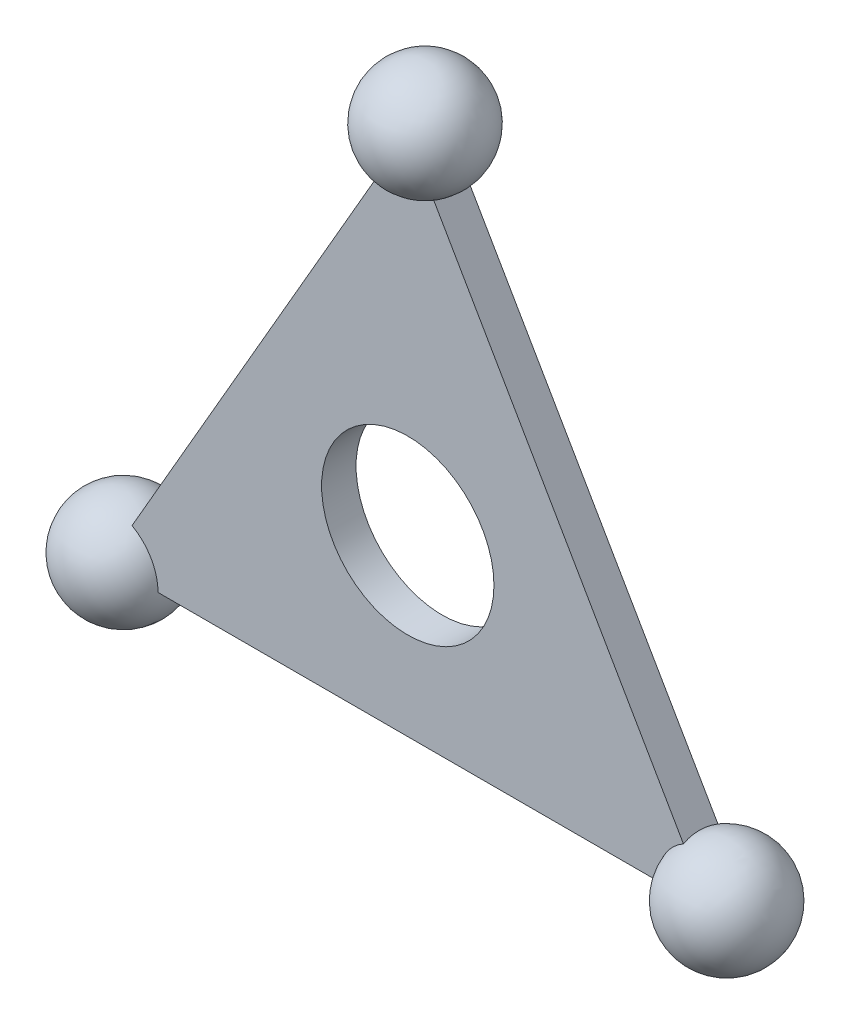
ISO-10303-21;
HEADER;
FILE_DESCRIPTION(('STEP AP214'),'2;1');
FILE_NAME('part.step','',(''),(''),'','','');
FILE_SCHEMA(('AUTOMOTIVE_DESIGN { 1 0 10303 214 1 1 1 1 }'));
ENDSEC;
DATA;
#1=APPLICATION_CONTEXT('core data for automotive mechanical design processes');
#2=APPLICATION_PROTOCOL_DEFINITION('international standard','automotive_design',2000,#1);
#3=PRODUCT_CONTEXT('',#1,'mechanical');
#4=PRODUCT('Part','Part','',(#3));
#5=PRODUCT_RELATED_PRODUCT_CATEGORY('part','',(#4));
#6=PRODUCT_DEFINITION_FORMATION('','',#4);
#7=PRODUCT_DEFINITION_CONTEXT('part definition',#1,'design');
#8=PRODUCT_DEFINITION('design','',#6,#7);
#9=PRODUCT_DEFINITION_SHAPE('','',#8);
#10=(LENGTH_UNIT() NAMED_UNIT(*) SI_UNIT(.MILLI.,.METRE.));
#11=(NAMED_UNIT(*) PLANE_ANGLE_UNIT() SI_UNIT($,.RADIAN.));
#12=(NAMED_UNIT(*) SI_UNIT($,.STERADIAN.) SOLID_ANGLE_UNIT());
#13=UNCERTAINTY_MEASURE_WITH_UNIT(LENGTH_MEASURE(1.E-05),#10,'distance_accuracy_value','');
#14=(GEOMETRIC_REPRESENTATION_CONTEXT(3) GLOBAL_UNCERTAINTY_ASSIGNED_CONTEXT((#13)) GLOBAL_UNIT_ASSIGNED_CONTEXT((#10,
#11,#12)) REPRESENTATION_CONTEXT('',''));
#15=CARTESIAN_POINT('',(0.,0.,0.));
#16=DIRECTION('',(0.,0.,1.));
#17=DIRECTION('',(1.,0.,0.));
#18=AXIS2_PLACEMENT_3D('',#15,#16,#17);
#19=CARTESIAN_POINT('',(0.,0.,2.));
#20=DIRECTION('',(0.,0.,1.));
#21=DIRECTION('',(1.,0.,0.));
#22=AXIS2_PLACEMENT_3D('',#19,#20,#21);
#23=PLANE('',#22);
#24=CARTESIAN_POINT('',(-35.,-20.2072594216365,2.));
#25=DIRECTION('',(0.,0.,1.));
#26=DIRECTION('',(1.,0.,0.));
#27=AXIS2_PLACEMENT_3D('',#24,#25,#26);
#28=CIRCLE('',#27,6.02681507929354);
#29=CARTESIAN_POINT('',(-28.9731849207064,-20.2072594216371,2.));
#30=VERTEX_POINT('',#29);
#31=CARTESIAN_POINT('',(-31.9865924603529,-14.9878844590573,2.));
#32=VERTEX_POINT('',#31);
#33=EDGE_CURVE('E87',#30,#32,#28,.T.);
#34=ORIENTED_EDGE('',*,*,#33,.F.);
#35=DIRECTION('',(1.,0.,0.));
#36=VECTOR('',#35,1.);
#37=CARTESIAN_POINT('',(-35.,-20.2072594216371,2.));
#38=LINE('',#37,#36);
#39=CARTESIAN_POINT('',(28.9731849207062,-20.2072594216371,2.));
#40=VERTEX_POINT('',#39);
#41=EDGE_CURVE('E57',#30,#40,#38,.T.);
#42=ORIENTED_EDGE('',*,*,#41,.T.);
#43=CARTESIAN_POINT('',(34.9999999999997,-20.2072594216369,2.));
#44=DIRECTION('',(0.,0.,1.));
#45=DIRECTION('',(1.,0.,0.));
#46=AXIS2_PLACEMENT_3D('',#43,#44,#45);
#47=CIRCLE('',#46,6.02681507929354);
#48=CARTESIAN_POINT('',(31.9865924603531,-14.9878844590575,2.));
#49=VERTEX_POINT('',#48);
#50=EDGE_CURVE('E135',#49,#40,#47,.T.);
#51=ORIENTED_EDGE('',*,*,#50,.F.);
#52=DIRECTION('',(-0.5,0.866025403784439,0.));
#53=VECTOR('',#52,1.);
#54=CARTESIAN_POINT('',(35.,-20.2072594216371,2.));
#55=LINE('',#54,#53);
#56=CARTESIAN_POINT('',(3.01340753964676,35.1951438806942,2.));
#57=VERTEX_POINT('',#56);
#58=EDGE_CURVE('E105',#49,#57,#55,.T.);
#59=ORIENTED_EDGE('',*,*,#58,.T.);
#60=CARTESIAN_POINT('',(0.,40.4145188432736,2.));
#61=DIRECTION('',(0.,0.,1.));
#62=DIRECTION('',(1.,0.,0.));
#63=AXIS2_PLACEMENT_3D('',#60,#61,#62);
#64=CIRCLE('',#63,6.02681507929354);
#65=CARTESIAN_POINT('',(-3.01340753964678,35.1951438806942,2.));
#66=VERTEX_POINT('',#65);
#67=EDGE_CURVE('E127',#66,#57,#64,.T.);
#68=ORIENTED_EDGE('',*,*,#67,.F.);
#69=DIRECTION('',(-0.5,-0.866025403784439,0.));
#70=VECTOR('',#69,1.);
#71=CARTESIAN_POINT('',(0.,40.4145188432736,2.));
#72=LINE('',#71,#70);
#73=EDGE_CURVE('E95',#66,#32,#72,.T.);
#74=ORIENTED_EDGE('',*,*,#73,.T.);
#75=EDGE_LOOP('',(#34,#42,#51,#59,#68,#74));
#76=FACE_BOUND('',#75,.T.);
#77=CARTESIAN_POINT('',(0.,0.,2.));
#78=DIRECTION('',(0.,0.,1.));
#79=DIRECTION('',(1.,0.,0.));
#80=AXIS2_PLACEMENT_3D('',#77,#78,#79);
#81=CIRCLE('',#80,10.);
#82=CARTESIAN_POINT('',(10.,0.,2.));
#83=VERTEX_POINT('',#82);
#84=EDGE_CURVE('E112',#83,#83,#81,.T.);
#85=ORIENTED_EDGE('',*,*,#84,.F.);
#86=EDGE_LOOP('',(#85));
#87=FACE_BOUND('',#86,.T.);
#88=ADVANCED_FACE('F35',(#76,#87),#23,.T.);
#89=CARTESIAN_POINT('',(0.,0.,-2.));
#90=DIRECTION('',(0.,0.,1.));
#91=DIRECTION('',(1.,0.,0.));
#92=AXIS2_PLACEMENT_3D('',#89,#90,#91);
#93=PLANE('',#92);
#94=DIRECTION('',(1.,0.,0.));
#95=VECTOR('',#94,1.);
#96=CARTESIAN_POINT('',(-35.,-20.2072594216371,-2.));
#97=LINE('',#96,#95);
#98=CARTESIAN_POINT('',(-28.9731849207064,-20.2072594216371,-2.));
#99=VERTEX_POINT('',#98);
#100=CARTESIAN_POINT('',(28.9731849207062,-20.2072594216371,-2.));
#101=VERTEX_POINT('',#100);
#102=EDGE_CURVE('E115',#99,#101,#97,.T.);
#103=ORIENTED_EDGE('',*,*,#102,.F.);
#104=CARTESIAN_POINT('',(-35.,-20.2072594216365,-2.));
#105=DIRECTION('',(0.,0.,1.));
#106=DIRECTION('',(1.,0.,0.));
#107=AXIS2_PLACEMENT_3D('',#104,#105,#106);
#108=CIRCLE('',#107,6.02681507929354);
#109=CARTESIAN_POINT('',(-31.9865924603529,-14.9878844590573,-2.));
#110=VERTEX_POINT('',#109);
#111=EDGE_CURVE('E50',#99,#110,#108,.T.);
#112=ORIENTED_EDGE('',*,*,#111,.T.);
#113=DIRECTION('',(-0.5,-0.866025403784439,0.));
#114=VECTOR('',#113,1.);
#115=CARTESIAN_POINT('',(0.,40.4145188432736,-2.));
#116=LINE('',#115,#114);
#117=CARTESIAN_POINT('',(-3.01340753964678,35.1951438806942,-2.));
#118=VERTEX_POINT('',#117);
#119=EDGE_CURVE('E111',#118,#110,#116,.T.);
#120=ORIENTED_EDGE('',*,*,#119,.F.);
#121=CARTESIAN_POINT('',(0.,40.4145188432736,-2.));
#122=DIRECTION('',(0.,0.,1.));
#123=DIRECTION('',(1.,0.,0.));
#124=AXIS2_PLACEMENT_3D('',#121,#122,#123);
#125=CIRCLE('',#124,6.02681507929354);
#126=CARTESIAN_POINT('',(3.01340753964676,35.1951438806942,-2.));
#127=VERTEX_POINT('',#126);
#128=EDGE_CURVE('E129',#118,#127,#125,.T.);
#129=ORIENTED_EDGE('',*,*,#128,.T.);
#130=DIRECTION('',(-0.5,0.866025403784439,0.));
#131=VECTOR('',#130,1.);
#132=CARTESIAN_POINT('',(35.,-20.2072594216371,-2.));
#133=LINE('',#132,#131);
#134=CARTESIAN_POINT('',(31.9865924603531,-14.9878844590575,-2.));
#135=VERTEX_POINT('',#134);
#136=EDGE_CURVE('E109',#135,#127,#133,.T.);
#137=ORIENTED_EDGE('',*,*,#136,.F.);
#138=CARTESIAN_POINT('',(34.9999999999997,-20.2072594216369,-2.));
#139=DIRECTION('',(0.,0.,1.));
#140=DIRECTION('',(1.,0.,0.));
#141=AXIS2_PLACEMENT_3D('',#138,#139,#140);
#142=CIRCLE('',#141,6.02681507929354);
#143=EDGE_CURVE('E137',#135,#101,#142,.T.);
#144=ORIENTED_EDGE('',*,*,#143,.T.);
#145=EDGE_LOOP('',(#103,#112,#120,#129,#137,#144));
#146=FACE_BOUND('',#145,.T.);
#147=CARTESIAN_POINT('',(0.,0.,-2.));
#148=DIRECTION('',(0.,0.,1.));
#149=DIRECTION('',(1.,0.,0.));
#150=AXIS2_PLACEMENT_3D('',#147,#148,#149);
#151=CIRCLE('',#150,10.);
#152=CARTESIAN_POINT('',(10.,0.,-2.));
#153=VERTEX_POINT('',#152);
#154=EDGE_CURVE('E119',#153,#153,#151,.T.);
#155=ORIENTED_EDGE('',*,*,#154,.T.);
#156=EDGE_LOOP('',(#155));
#157=FACE_BOUND('',#156,.T.);
#158=ADVANCED_FACE('F143',(#146,#157),#93,.F.);
#159=CARTESIAN_POINT('',(35.,-20.2072594216371,2.));
#160=DIRECTION('',(-0.866025403784439,-0.5,0.));
#161=DIRECTION('',(0.5,-0.866025403784439,0.));
#162=AXIS2_PLACEMENT_3D('',#159,#160,#161);
#163=PLANE('',#162);
#164=ORIENTED_EDGE('',*,*,#58,.F.);
#165=CARTESIAN_POINT('',(34.9999999999999,-20.2072594216369,0.));
#166=DIRECTION('',(-0.866025403784439,-0.5,0.));
#167=DIRECTION('',(0.5,-0.866025403784439,0.));
#168=AXIS2_PLACEMENT_3D('',#165,#166,#167);
#169=CIRCLE('',#168,6.35);
#170=EDGE_CURVE('E132',#49,#135,#169,.T.);
#171=ORIENTED_EDGE('',*,*,#170,.T.);
#172=ORIENTED_EDGE('',*,*,#136,.T.);
#173=CARTESIAN_POINT('',(0.,40.4145188432736,0.));
#174=DIRECTION('',(-0.866025403784439,-0.5,0.));
#175=DIRECTION('',(0.5,-0.866025403784439,0.));
#176=AXIS2_PLACEMENT_3D('',#173,#174,#175);
#177=CIRCLE('',#176,6.35);
#178=EDGE_CURVE('E122',#127,#57,#177,.T.);
#179=ORIENTED_EDGE('',*,*,#178,.T.);
#180=EDGE_LOOP('',(#164,#171,#172,#179));
#181=FACE_BOUND('',#180,.T.);
#182=ADVANCED_FACE('F37',(#181),#163,.F.);
#183=CARTESIAN_POINT('',(0.,40.4145188432736,2.));
#184=DIRECTION('',(0.866025403784439,-0.5,0.));
#185=DIRECTION('',(0.5,0.866025403784439,0.));
#186=AXIS2_PLACEMENT_3D('',#183,#184,#185);
#187=PLANE('',#186);
#188=ORIENTED_EDGE('',*,*,#119,.T.);
#189=CARTESIAN_POINT('',(-34.9999999999997,-20.2072594216366,0.));
#190=DIRECTION('',(0.866025403784439,-0.5,0.));
#191=DIRECTION('',(0.5,0.866025403784439,0.));
#192=AXIS2_PLACEMENT_3D('',#189,#190,#191);
#193=CIRCLE('',#192,6.35);
#194=EDGE_CURVE('E96',#110,#32,#193,.T.);
#195=ORIENTED_EDGE('',*,*,#194,.T.);
#196=ORIENTED_EDGE('',*,*,#73,.F.);
#197=CARTESIAN_POINT('',(0.,40.4145188432736,0.));
#198=DIRECTION('',(0.866025403784439,-0.5,0.));
#199=DIRECTION('',(0.5,0.866025403784439,0.));
#200=AXIS2_PLACEMENT_3D('',#197,#198,#199);
#201=CIRCLE('',#200,6.35);
#202=EDGE_CURVE('E101',#66,#118,#201,.T.);
#203=ORIENTED_EDGE('',*,*,#202,.T.);
#204=EDGE_LOOP('',(#188,#195,#196,#203));
#205=FACE_BOUND('',#204,.T.);
#206=ADVANCED_FACE('F146',(#205),#187,.F.);
#207=CARTESIAN_POINT('',(-35.,-20.2072594216371,2.));
#208=DIRECTION('',(0.,1.,0.));
#209=DIRECTION('',(-1.,0.,0.));
#210=AXIS2_PLACEMENT_3D('',#207,#208,#209);
#211=PLANE('',#210);
#212=ORIENTED_EDGE('',*,*,#41,.F.);
#213=CARTESIAN_POINT('',(-35.,-20.2072594216371,0.));
#214=DIRECTION('',(0.,1.,0.));
#215=DIRECTION('',(-1.,0.,0.));
#216=AXIS2_PLACEMENT_3D('',#213,#214,#215);
#217=CIRCLE('',#216,6.35);
#218=EDGE_CURVE('E11',#30,#99,#217,.T.);
#219=ORIENTED_EDGE('',*,*,#218,.T.);
#220=ORIENTED_EDGE('',*,*,#102,.T.);
#221=CARTESIAN_POINT('',(34.9999999999997,-20.2072594216371,0.));
#222=DIRECTION('',(0.,1.,0.));
#223=DIRECTION('',(-1.,0.,0.));
#224=AXIS2_PLACEMENT_3D('',#221,#222,#223);
#225=CIRCLE('',#224,6.35);
#226=EDGE_CURVE('E43',#101,#40,#225,.T.);
#227=ORIENTED_EDGE('',*,*,#226,.T.);
#228=EDGE_LOOP('',(#212,#219,#220,#227));
#229=FACE_BOUND('',#228,.T.);
#230=ADVANCED_FACE('F99',(#229),#211,.F.);
#231=CARTESIAN_POINT('',(0.,0.,2.));
#232=DIRECTION('',(0.,0.,-1.));
#233=DIRECTION('',(-1.,0.,0.));
#234=AXIS2_PLACEMENT_3D('',#231,#232,#233);
#235=CYLINDRICAL_SURFACE('',#234,10.);
#236=ORIENTED_EDGE('',*,*,#84,.T.);
#237=EDGE_LOOP('',(#236));
#238=FACE_BOUND('',#237,.T.);
#239=ORIENTED_EDGE('',*,*,#154,.F.);
#240=EDGE_LOOP('',(#239));
#241=FACE_BOUND('',#240,.T.);
#242=ADVANCED_FACE('F161',(#238,#241),#235,.F.);
#243=CARTESIAN_POINT('',(0.,40.4145188432736,0.));
#244=DIRECTION('',(0.,1.,0.));
#245=DIRECTION('',(-1.,0.,0.));
#246=AXIS2_PLACEMENT_3D('',#243,#244,#245);
#247=SPHERICAL_SURFACE('',#246,6.35);
#248=ORIENTED_EDGE('',*,*,#178,.F.);
#249=ORIENTED_EDGE('',*,*,#128,.F.);
#250=ORIENTED_EDGE('',*,*,#202,.F.);
#251=ORIENTED_EDGE('',*,*,#67,.T.);
#252=EDGE_LOOP('',(#248,#249,#250,#251));
#253=FACE_BOUND('',#252,.T.);
#254=ADVANCED_FACE('F149',(#253),#247,.T.);
#255=CARTESIAN_POINT('',(34.9999999999997,-20.2072594216369,0.));
#256=DIRECTION('',(0.866025403784437,-0.500000000000004,0.));
#257=DIRECTION('',(0.500000000000004,0.866025403784437,0.));
#258=AXIS2_PLACEMENT_3D('',#255,#256,#257);
#259=SPHERICAL_SURFACE('',#258,6.35);
#260=ORIENTED_EDGE('',*,*,#170,.F.);
#261=ORIENTED_EDGE('',*,*,#50,.T.);
#262=ORIENTED_EDGE('',*,*,#226,.F.);
#263=ORIENTED_EDGE('',*,*,#143,.F.);
#264=EDGE_LOOP('',(#260,#261,#262,#263));
#265=FACE_BOUND('',#264,.T.);
#266=ADVANCED_FACE('F153',(#265),#259,.T.);
#267=CARTESIAN_POINT('',(-35.,-20.2072594216365,0.));
#268=DIRECTION('',(-0.866025403784443,-0.499999999999992,0.));
#269=DIRECTION('',(0.499999999999992,-0.866025403784443,0.));
#270=AXIS2_PLACEMENT_3D('',#267,#268,#269);
#271=SPHERICAL_SURFACE('',#270,6.35);
#272=ORIENTED_EDGE('',*,*,#194,.F.);
#273=ORIENTED_EDGE('',*,*,#111,.F.);
#274=ORIENTED_EDGE('',*,*,#218,.F.);
#275=ORIENTED_EDGE('',*,*,#33,.T.);
#276=EDGE_LOOP('',(#272,#273,#274,#275));
#277=FACE_BOUND('',#276,.T.);
#278=ADVANCED_FACE('F86',(#277),#271,.T.);
#279=CLOSED_SHELL('',(#88,#158,#182,#206,#230,#242,#254,#266,#278));
#280=MANIFOLD_SOLID_BREP('B2',#279);
#281=ADVANCED_BREP_SHAPE_REPRESENTATION('',(#18,#280),#14);
#282=SHAPE_DEFINITION_REPRESENTATION(#9,#281);
ENDSEC;
END-ISO-10303-21;
